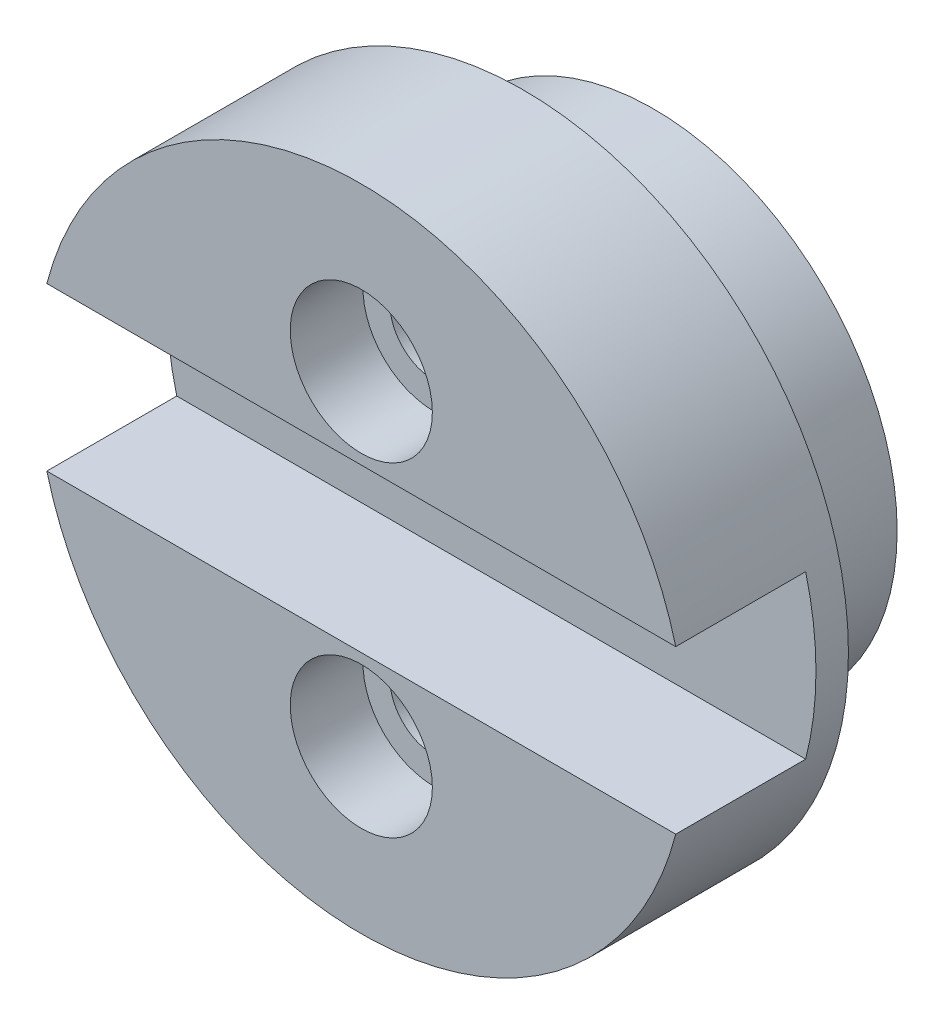
ISO-10303-21;
HEADER;
FILE_DESCRIPTION(('STEP AP214'),'2;1');
FILE_NAME('part.step','',(''),(''),'','','');
FILE_SCHEMA(('AUTOMOTIVE_DESIGN { 1 0 10303 214 1 1 1 1 }'));
ENDSEC;
DATA;
#1=APPLICATION_CONTEXT('core data for automotive mechanical design processes');
#2=APPLICATION_PROTOCOL_DEFINITION('international standard','automotive_design',2000,#1);
#3=PRODUCT_CONTEXT('',#1,'mechanical');
#4=PRODUCT('Part','Part','',(#3));
#5=PRODUCT_RELATED_PRODUCT_CATEGORY('part','',(#4));
#6=PRODUCT_DEFINITION_FORMATION('','',#4);
#7=PRODUCT_DEFINITION_CONTEXT('part definition',#1,'design');
#8=PRODUCT_DEFINITION('design','',#6,#7);
#9=PRODUCT_DEFINITION_SHAPE('','',#8);
#10=(LENGTH_UNIT() NAMED_UNIT(*) SI_UNIT(.MILLI.,.METRE.));
#11=(NAMED_UNIT(*) PLANE_ANGLE_UNIT() SI_UNIT($,.RADIAN.));
#12=(NAMED_UNIT(*) SI_UNIT($,.STERADIAN.) SOLID_ANGLE_UNIT());
#13=UNCERTAINTY_MEASURE_WITH_UNIT(LENGTH_MEASURE(1.E-05),#10,'distance_accuracy_value','');
#14=(GEOMETRIC_REPRESENTATION_CONTEXT(3) GLOBAL_UNCERTAINTY_ASSIGNED_CONTEXT((#13)) GLOBAL_UNIT_ASSIGNED_CONTEXT((#10,
#11,#12)) REPRESENTATION_CONTEXT('',''));
#15=CARTESIAN_POINT('',(0.,0.,0.));
#16=DIRECTION('',(0.,0.,1.));
#17=DIRECTION('',(1.,0.,0.));
#18=AXIS2_PLACEMENT_3D('',#15,#16,#17);
#19=CARTESIAN_POINT('',(0.,0.,11.43));
#20=DIRECTION('',(0.,0.,1.));
#21=DIRECTION('',(1.,0.,0.));
#22=AXIS2_PLACEMENT_3D('',#19,#20,#21);
#23=PLANE('',#22);
#24=CARTESIAN_POINT('',(0.,6.35,11.43));
#25=DIRECTION('',(0.,0.,1.));
#26=DIRECTION('',(1.,0.,0.));
#27=AXIS2_PLACEMENT_3D('',#24,#25,#26);
#28=CIRCLE('',#27,2.77876);
#29=CARTESIAN_POINT('',(2.77876,6.35,11.43));
#30=VERTEX_POINT('',#29);
#31=EDGE_CURVE('E126',#30,#30,#28,.T.);
#32=ORIENTED_EDGE('',*,*,#31,.F.);
#33=EDGE_LOOP('',(#32));
#34=FACE_BOUND('',#33,.T.);
#35=DIRECTION('',(-1.,0.,0.));
#36=VECTOR('',#35,1.);
#37=CARTESIAN_POINT('',(0.,3.175,11.43));
#38=LINE('',#37,#36);
#39=CARTESIAN_POINT('',(12.2967221242086,3.175,11.43));
#40=VERTEX_POINT('',#39);
#41=CARTESIAN_POINT('',(-12.2967221242086,3.175,11.43));
#42=VERTEX_POINT('',#41);
#43=EDGE_CURVE('E78',#40,#42,#38,.T.);
#44=ORIENTED_EDGE('',*,*,#43,.F.);
#45=CARTESIAN_POINT('',(0.,0.,11.43));
#46=DIRECTION('',(0.,0.,1.));
#47=DIRECTION('',(1.,0.,0.));
#48=AXIS2_PLACEMENT_3D('',#45,#46,#47);
#49=CIRCLE('',#48,12.7);
#50=EDGE_CURVE('E89',#40,#42,#49,.T.);
#51=ORIENTED_EDGE('',*,*,#50,.T.);
#52=EDGE_LOOP('',(#44,#51));
#53=FACE_BOUND('',#52,.T.);
#54=ADVANCED_FACE('F33',(#34,#53),#23,.T.);
#55=CARTESIAN_POINT('',(0.,0.,5.08));
#56=DIRECTION('',(0.,0.,-1.));
#57=DIRECTION('',(-1.,0.,0.));
#58=AXIS2_PLACEMENT_3D('',#55,#56,#57);
#59=CYLINDRICAL_SURFACE('',#58,9.525);
#60=CARTESIAN_POINT('',(0.,0.,5.08));
#61=DIRECTION('',(0.,0.,1.));
#62=DIRECTION('',(1.,0.,0.));
#63=AXIS2_PLACEMENT_3D('',#60,#61,#62);
#64=CIRCLE('',#63,9.525);
#65=CARTESIAN_POINT('',(9.525,0.,5.08));
#66=VERTEX_POINT('',#65);
#67=EDGE_CURVE('E79',#66,#66,#64,.T.);
#68=ORIENTED_EDGE('',*,*,#67,.F.);
#69=EDGE_LOOP('',(#68));
#70=FACE_BOUND('',#69,.T.);
#71=CARTESIAN_POINT('',(0.,0.,0.));
#72=DIRECTION('',(0.,0.,1.));
#73=DIRECTION('',(1.,0.,0.));
#74=AXIS2_PLACEMENT_3D('',#71,#72,#73);
#75=CIRCLE('',#74,9.525);
#76=CARTESIAN_POINT('',(9.525,0.,0.));
#77=VERTEX_POINT('',#76);
#78=EDGE_CURVE('E93',#77,#77,#75,.T.);
#79=ORIENTED_EDGE('',*,*,#78,.T.);
#80=EDGE_LOOP('',(#79));
#81=FACE_BOUND('',#80,.T.);
#82=ADVANCED_FACE('F35',(#70,#81),#59,.T.);
#83=CARTESIAN_POINT('',(0.,0.,0.));
#84=DIRECTION('',(0.,0.,1.));
#85=DIRECTION('',(1.,0.,0.));
#86=AXIS2_PLACEMENT_3D('',#83,#84,#85);
#87=PLANE('',#86);
#88=CARTESIAN_POINT('',(0.,-6.35,0.));
#89=DIRECTION('',(0.,0.,1.));
#90=DIRECTION('',(1.,0.,0.));
#91=AXIS2_PLACEMENT_3D('',#88,#89,#90);
#92=CIRCLE('',#91,1.7272);
#93=CARTESIAN_POINT('',(1.7272,-6.35,0.));
#94=VERTEX_POINT('',#93);
#95=EDGE_CURVE('E129',#94,#94,#92,.T.);
#96=ORIENTED_EDGE('',*,*,#95,.T.);
#97=EDGE_LOOP('',(#96));
#98=FACE_BOUND('',#97,.T.);
#99=CARTESIAN_POINT('',(0.,6.35,0.));
#100=DIRECTION('',(0.,0.,1.));
#101=DIRECTION('',(1.,0.,0.));
#102=AXIS2_PLACEMENT_3D('',#99,#100,#101);
#103=CIRCLE('',#102,1.7272);
#104=CARTESIAN_POINT('',(1.7272,6.35,0.));
#105=VERTEX_POINT('',#104);
#106=EDGE_CURVE('E117',#105,#105,#103,.T.);
#107=ORIENTED_EDGE('',*,*,#106,.T.);
#108=EDGE_LOOP('',(#107));
#109=FACE_BOUND('',#108,.T.);
#110=ORIENTED_EDGE('',*,*,#78,.F.);
#111=EDGE_LOOP('',(#110));
#112=FACE_BOUND('',#111,.T.);
#113=ADVANCED_FACE('F160',(#98,#109,#112),#87,.F.);
#114=CARTESIAN_POINT('',(0.,0.,5.08));
#115=DIRECTION('',(0.,0.,1.));
#116=DIRECTION('',(1.,0.,0.));
#117=AXIS2_PLACEMENT_3D('',#114,#115,#116);
#118=PLANE('',#117);
#119=CARTESIAN_POINT('',(0.,0.,5.08));
#120=DIRECTION('',(0.,0.,1.));
#121=DIRECTION('',(1.,0.,0.));
#122=AXIS2_PLACEMENT_3D('',#119,#120,#121);
#123=CIRCLE('',#122,12.7);
#124=CARTESIAN_POINT('',(12.7,0.,5.08));
#125=VERTEX_POINT('',#124);
#126=EDGE_CURVE('E90',#125,#125,#123,.T.);
#127=ORIENTED_EDGE('',*,*,#126,.F.);
#128=EDGE_LOOP('',(#127));
#129=FACE_BOUND('',#128,.T.);
#130=ORIENTED_EDGE('',*,*,#67,.T.);
#131=EDGE_LOOP('',(#130));
#132=FACE_BOUND('',#131,.T.);
#133=ADVANCED_FACE('F151',(#129,#132),#118,.F.);
#134=CARTESIAN_POINT('',(0.,0.,11.43));
#135=DIRECTION('',(0.,0.,-1.));
#136=DIRECTION('',(-1.,0.,0.));
#137=AXIS2_PLACEMENT_3D('',#134,#135,#136);
#138=CYLINDRICAL_SURFACE('',#137,12.7);
#139=CARTESIAN_POINT('',(0.,0.,6.35));
#140=DIRECTION('',(0.,0.,1.));
#141=DIRECTION('',(1.,0.,0.));
#142=AXIS2_PLACEMENT_3D('',#139,#140,#141);
#143=CIRCLE('',#142,12.7);
#144=CARTESIAN_POINT('',(-12.2967221242086,3.175,6.35));
#145=VERTEX_POINT('',#144);
#146=CARTESIAN_POINT('',(-12.2967221242085,-3.175,6.35));
#147=VERTEX_POINT('',#146);
#148=EDGE_CURVE('E11',#145,#147,#143,.T.);
#149=ORIENTED_EDGE('',*,*,#148,.F.);
#150=DIRECTION('',(0.,0.,-1.));
#151=VECTOR('',#150,1.);
#152=CARTESIAN_POINT('',(-12.2967221242086,3.175,11.43));
#153=LINE('',#152,#151);
#154=EDGE_CURVE('E111',#145,#42,#153,.F.);
#155=ORIENTED_EDGE('',*,*,#154,.T.);
#156=ORIENTED_EDGE('',*,*,#50,.F.);
#157=DIRECTION('',(0.,0.,-1.));
#158=VECTOR('',#157,1.);
#159=CARTESIAN_POINT('',(12.2967221242086,3.175,11.43));
#160=LINE('',#159,#158);
#161=CARTESIAN_POINT('',(12.2967221242086,3.175,6.35));
#162=VERTEX_POINT('',#161);
#163=EDGE_CURVE('E95',#40,#162,#160,.T.);
#164=ORIENTED_EDGE('',*,*,#163,.T.);
#165=CARTESIAN_POINT('',(12.2967221242085,-3.175,6.35));
#166=VERTEX_POINT('',#165);
#167=EDGE_CURVE('E37',#166,#162,#143,.T.);
#168=ORIENTED_EDGE('',*,*,#167,.F.);
#169=DIRECTION('',(0.,0.,-1.));
#170=VECTOR('',#169,1.);
#171=CARTESIAN_POINT('',(12.2967221242085,-3.175,11.43));
#172=LINE('',#171,#170);
#173=CARTESIAN_POINT('',(12.2967221242085,-3.175,11.43));
#174=VERTEX_POINT('',#173);
#175=EDGE_CURVE('E73',#166,#174,#172,.F.);
#176=ORIENTED_EDGE('',*,*,#175,.T.);
#177=CARTESIAN_POINT('',(-12.2967221242085,-3.175,11.43));
#178=VERTEX_POINT('',#177);
#179=EDGE_CURVE('E84',#178,#174,#49,.T.);
#180=ORIENTED_EDGE('',*,*,#179,.F.);
#181=DIRECTION('',(0.,0.,-1.));
#182=VECTOR('',#181,1.);
#183=CARTESIAN_POINT('',(-12.2967221242085,-3.175,11.43));
#184=LINE('',#183,#182);
#185=EDGE_CURVE('E48',#178,#147,#184,.T.);
#186=ORIENTED_EDGE('',*,*,#185,.T.);
#187=EDGE_LOOP('',(#149,#155,#156,#164,#168,#176,#180,#186));
#188=FACE_BOUND('',#187,.T.);
#189=ORIENTED_EDGE('',*,*,#126,.T.);
#190=EDGE_LOOP('',(#189));
#191=FACE_BOUND('',#190,.T.);
#192=ADVANCED_FACE('F82',(#188,#191),#138,.T.);
#193=CARTESIAN_POINT('',(0.,-6.35,11.43));
#194=DIRECTION('',(0.,0.,1.));
#195=DIRECTION('',(1.,0.,0.));
#196=AXIS2_PLACEMENT_3D('',#193,#194,#195);
#197=CIRCLE('',#196,2.77876);
#198=CARTESIAN_POINT('',(2.77876,-6.35,11.43));
#199=VERTEX_POINT('',#198);
#200=EDGE_CURVE('E138',#199,#199,#197,.T.);
#201=ORIENTED_EDGE('',*,*,#200,.F.);
#202=EDGE_LOOP('',(#201));
#203=FACE_BOUND('',#202,.T.);
#204=DIRECTION('',(1.,0.,0.));
#205=VECTOR('',#204,1.);
#206=CARTESIAN_POINT('',(0.,-3.175,11.43));
#207=LINE('',#206,#205);
#208=EDGE_CURVE('E70',#178,#174,#207,.T.);
#209=ORIENTED_EDGE('',*,*,#208,.F.);
#210=ORIENTED_EDGE('',*,*,#179,.T.);
#211=EDGE_LOOP('',(#209,#210));
#212=FACE_BOUND('',#211,.T.);
#213=ADVANCED_FACE('F88',(#203,#212),#23,.T.);
#214=CARTESIAN_POINT('',(0.,0.,6.35));
#215=DIRECTION('',(0.,0.,1.));
#216=DIRECTION('',(1.,0.,0.));
#217=AXIS2_PLACEMENT_3D('',#214,#215,#216);
#218=PLANE('',#217);
#219=DIRECTION('',(-1.,0.,0.));
#220=VECTOR('',#219,1.);
#221=CARTESIAN_POINT('',(12.7,3.175,6.35));
#222=LINE('',#221,#220);
#223=EDGE_CURVE('E86',#162,#145,#222,.T.);
#224=ORIENTED_EDGE('',*,*,#223,.T.);
#225=ORIENTED_EDGE('',*,*,#148,.T.);
#226=DIRECTION('',(1.,0.,0.));
#227=VECTOR('',#226,1.);
#228=CARTESIAN_POINT('',(12.7,-3.175,6.35));
#229=LINE('',#228,#227);
#230=EDGE_CURVE('E109',#147,#166,#229,.T.);
#231=ORIENTED_EDGE('',*,*,#230,.T.);
#232=ORIENTED_EDGE('',*,*,#167,.T.);
#233=EDGE_LOOP('',(#224,#225,#231,#232));
#234=FACE_BOUND('',#233,.T.);
#235=ADVANCED_FACE('F108',(#234),#218,.T.);
#236=CARTESIAN_POINT('',(12.7,3.175,6.35));
#237=DIRECTION('',(0.,1.,0.));
#238=DIRECTION('',(-1.,0.,0.));
#239=AXIS2_PLACEMENT_3D('',#236,#237,#238);
#240=PLANE('',#239);
#241=ORIENTED_EDGE('',*,*,#43,.T.);
#242=ORIENTED_EDGE('',*,*,#154,.F.);
#243=ORIENTED_EDGE('',*,*,#223,.F.);
#244=ORIENTED_EDGE('',*,*,#163,.F.);
#245=EDGE_LOOP('',(#241,#242,#243,#244));
#246=FACE_BOUND('',#245,.T.);
#247=ADVANCED_FACE('F110',(#246),#240,.F.);
#248=CARTESIAN_POINT('',(12.7,-3.175,6.35));
#249=DIRECTION('',(0.,-1.,0.));
#250=DIRECTION('',(1.,0.,0.));
#251=AXIS2_PLACEMENT_3D('',#248,#249,#250);
#252=PLANE('',#251);
#253=ORIENTED_EDGE('',*,*,#208,.T.);
#254=ORIENTED_EDGE('',*,*,#175,.F.);
#255=ORIENTED_EDGE('',*,*,#230,.F.);
#256=ORIENTED_EDGE('',*,*,#185,.F.);
#257=EDGE_LOOP('',(#253,#254,#255,#256));
#258=FACE_BOUND('',#257,.T.);
#259=ADVANCED_FACE('F72',(#258),#252,.F.);
#260=CARTESIAN_POINT('',(0.,6.35,11.43));
#261=DIRECTION('',(0.,0.,1.));
#262=DIRECTION('',(1.,0.,0.));
#263=AXIS2_PLACEMENT_3D('',#260,#261,#262);
#264=CYLINDRICAL_SURFACE('',#263,1.7272);
#265=ORIENTED_EDGE('',*,*,#106,.F.);
#266=EDGE_LOOP('',(#265));
#267=FACE_BOUND('',#266,.T.);
#268=CARTESIAN_POINT('',(0.,6.35,8.5852));
#269=DIRECTION('',(0.,0.,1.));
#270=DIRECTION('',(1.,0.,0.));
#271=AXIS2_PLACEMENT_3D('',#268,#269,#270);
#272=CIRCLE('',#271,1.7272);
#273=CARTESIAN_POINT('',(1.7272,6.35,8.5852));
#274=VERTEX_POINT('',#273);
#275=EDGE_CURVE('E120',#274,#274,#272,.T.);
#276=ORIENTED_EDGE('',*,*,#275,.T.);
#277=EDGE_LOOP('',(#276));
#278=FACE_BOUND('',#277,.T.);
#279=ADVANCED_FACE('F178',(#267,#278),#264,.F.);
#280=CARTESIAN_POINT('',(1.7272,6.35,8.5852));
#281=DIRECTION('',(0.,0.,-1.));
#282=DIRECTION('',(-1.,0.,0.));
#283=AXIS2_PLACEMENT_3D('',#280,#281,#282);
#284=PLANE('',#283);
#285=ORIENTED_EDGE('',*,*,#275,.F.);
#286=EDGE_LOOP('',(#285));
#287=FACE_BOUND('',#286,.T.);
#288=CARTESIAN_POINT('',(0.,6.35,8.5852));
#289=DIRECTION('',(0.,0.,1.));
#290=DIRECTION('',(1.,0.,0.));
#291=AXIS2_PLACEMENT_3D('',#288,#289,#290);
#292=CIRCLE('',#291,2.77876);
#293=CARTESIAN_POINT('',(2.77876,6.35,8.5852));
#294=VERTEX_POINT('',#293);
#295=EDGE_CURVE('E123',#294,#294,#292,.T.);
#296=ORIENTED_EDGE('',*,*,#295,.T.);
#297=EDGE_LOOP('',(#296));
#298=FACE_BOUND('',#297,.T.);
#299=ADVANCED_FACE('F168',(#287,#298),#284,.F.);
#300=CARTESIAN_POINT('',(0.,6.35,11.43));
#301=DIRECTION('',(0.,0.,1.));
#302=DIRECTION('',(1.,0.,0.));
#303=AXIS2_PLACEMENT_3D('',#300,#301,#302);
#304=CYLINDRICAL_SURFACE('',#303,2.77876);
#305=ORIENTED_EDGE('',*,*,#295,.F.);
#306=EDGE_LOOP('',(#305));
#307=FACE_BOUND('',#306,.T.);
#308=ORIENTED_EDGE('',*,*,#31,.T.);
#309=EDGE_LOOP('',(#308));
#310=FACE_BOUND('',#309,.T.);
#311=ADVANCED_FACE('F165',(#307,#310),#304,.F.);
#312=CARTESIAN_POINT('',(0.,-6.35,11.43));
#313=DIRECTION('',(0.,0.,1.));
#314=DIRECTION('',(1.,0.,0.));
#315=AXIS2_PLACEMENT_3D('',#312,#313,#314);
#316=CYLINDRICAL_SURFACE('',#315,1.7272);
#317=ORIENTED_EDGE('',*,*,#95,.F.);
#318=EDGE_LOOP('',(#317));
#319=FACE_BOUND('',#318,.T.);
#320=CARTESIAN_POINT('',(0.,-6.35,8.5852));
#321=DIRECTION('',(0.,0.,1.));
#322=DIRECTION('',(1.,0.,0.));
#323=AXIS2_PLACEMENT_3D('',#320,#321,#322);
#324=CIRCLE('',#323,1.7272);
#325=CARTESIAN_POINT('',(1.7272,-6.35,8.5852));
#326=VERTEX_POINT('',#325);
#327=EDGE_CURVE('E132',#326,#326,#324,.T.);
#328=ORIENTED_EDGE('',*,*,#327,.T.);
#329=EDGE_LOOP('',(#328));
#330=FACE_BOUND('',#329,.T.);
#331=ADVANCED_FACE('F167',(#319,#330),#316,.F.);
#332=CARTESIAN_POINT('',(1.7272,-6.35,8.5852));
#333=DIRECTION('',(0.,0.,-1.));
#334=DIRECTION('',(-1.,0.,0.));
#335=AXIS2_PLACEMENT_3D('',#332,#333,#334);
#336=PLANE('',#335);
#337=ORIENTED_EDGE('',*,*,#327,.F.);
#338=EDGE_LOOP('',(#337));
#339=FACE_BOUND('',#338,.T.);
#340=CARTESIAN_POINT('',(0.,-6.35,8.5852));
#341=DIRECTION('',(0.,0.,1.));
#342=DIRECTION('',(1.,0.,0.));
#343=AXIS2_PLACEMENT_3D('',#340,#341,#342);
#344=CIRCLE('',#343,2.77876);
#345=CARTESIAN_POINT('',(2.77876,-6.35,8.5852));
#346=VERTEX_POINT('',#345);
#347=EDGE_CURVE('E135',#346,#346,#344,.T.);
#348=ORIENTED_EDGE('',*,*,#347,.T.);
#349=EDGE_LOOP('',(#348));
#350=FACE_BOUND('',#349,.T.);
#351=ADVANCED_FACE('F175',(#339,#350),#336,.F.);
#352=CARTESIAN_POINT('',(0.,-6.35,11.43));
#353=DIRECTION('',(0.,0.,1.));
#354=DIRECTION('',(1.,0.,0.));
#355=AXIS2_PLACEMENT_3D('',#352,#353,#354);
#356=CYLINDRICAL_SURFACE('',#355,2.77876);
#357=ORIENTED_EDGE('',*,*,#347,.F.);
#358=EDGE_LOOP('',(#357));
#359=FACE_BOUND('',#358,.T.);
#360=ORIENTED_EDGE('',*,*,#200,.T.);
#361=EDGE_LOOP('',(#360));
#362=FACE_BOUND('',#361,.T.);
#363=ADVANCED_FACE('F142',(#359,#362),#356,.F.);
#364=CLOSED_SHELL('',(#54,#82,#113,#133,#192,#213,#235,#247,#259,#279,#299,#311,#331,#351,#363));
#365=MANIFOLD_SOLID_BREP('B2',#364);
#366=ADVANCED_BREP_SHAPE_REPRESENTATION('',(#18,#365),#14);
#367=SHAPE_DEFINITION_REPRESENTATION(#9,#366);
ENDSEC;
END-ISO-10303-21;
